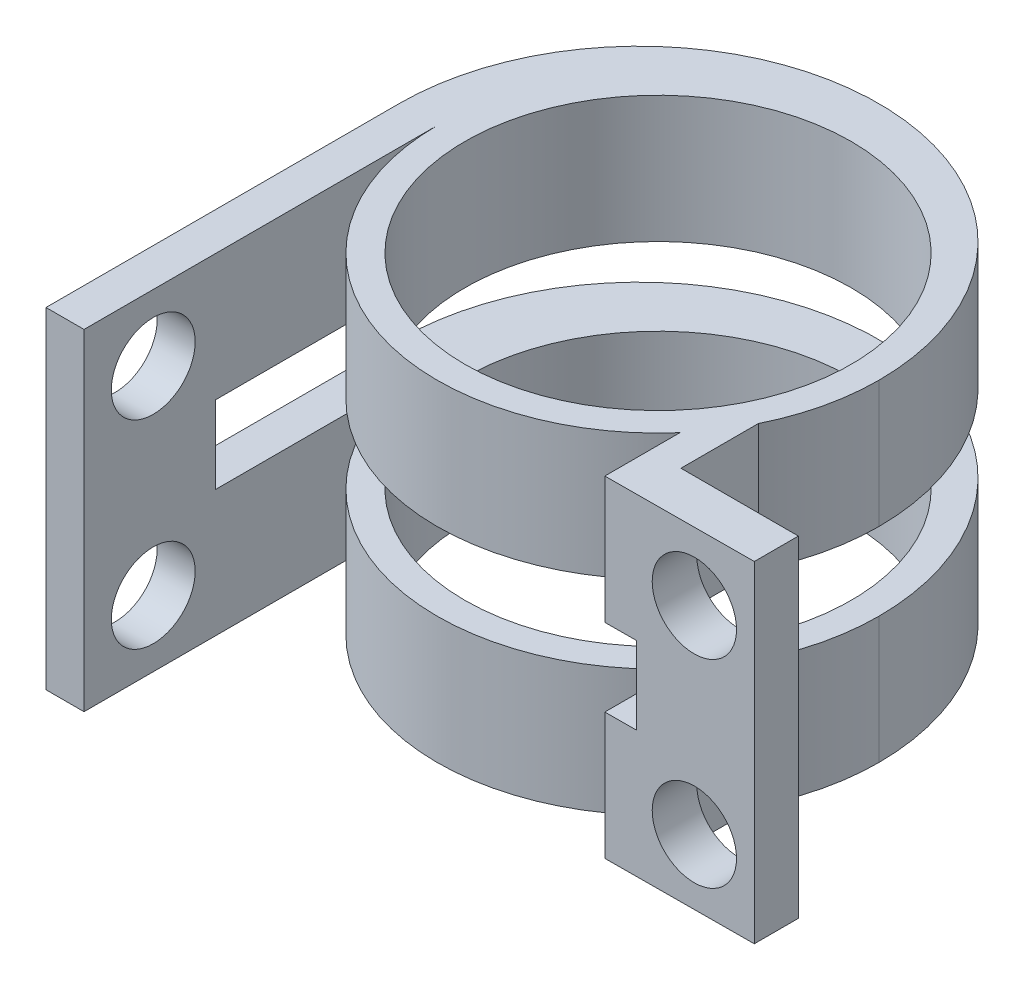
ISO-10303-21;
HEADER;
FILE_DESCRIPTION(('STEP AP214'),'2;1');
FILE_NAME('part.step','',(''),(''),'','','');
FILE_SCHEMA(('AUTOMOTIVE_DESIGN { 1 0 10303 214 1 1 1 1 }'));
ENDSEC;
DATA;
#1=APPLICATION_CONTEXT('core data for automotive mechanical design processes');
#2=APPLICATION_PROTOCOL_DEFINITION('international standard','automotive_design',2000,#1);
#3=PRODUCT_CONTEXT('',#1,'mechanical');
#4=PRODUCT('Part','Part','',(#3));
#5=PRODUCT_RELATED_PRODUCT_CATEGORY('part','',(#4));
#6=PRODUCT_DEFINITION_FORMATION('','',#4);
#7=PRODUCT_DEFINITION_CONTEXT('part definition',#1,'design');
#8=PRODUCT_DEFINITION('design','',#6,#7);
#9=PRODUCT_DEFINITION_SHAPE('','',#8);
#10=(LENGTH_UNIT() NAMED_UNIT(*) SI_UNIT(.MILLI.,.METRE.));
#11=(NAMED_UNIT(*) PLANE_ANGLE_UNIT() SI_UNIT($,.RADIAN.));
#12=(NAMED_UNIT(*) SI_UNIT($,.STERADIAN.) SOLID_ANGLE_UNIT());
#13=UNCERTAINTY_MEASURE_WITH_UNIT(LENGTH_MEASURE(1.E-05),#10,'distance_accuracy_value','');
#14=(GEOMETRIC_REPRESENTATION_CONTEXT(3) GLOBAL_UNCERTAINTY_ASSIGNED_CONTEXT((#13)) GLOBAL_UNIT_ASSIGNED_CONTEXT((#10,
#11,#12)) REPRESENTATION_CONTEXT('',''));
#15=CARTESIAN_POINT('',(0.,0.,0.));
#16=DIRECTION('',(0.,0.,1.));
#17=DIRECTION('',(1.,0.,0.));
#18=AXIS2_PLACEMENT_3D('',#15,#16,#17);
#19=CARTESIAN_POINT('',(-0.861319558408685,-15.,0.));
#20=DIRECTION('',(0.,1.,0.));
#21=DIRECTION('',(0.,0.,1.));
#22=AXIS2_PLACEMENT_3D('',#19,#20,#21);
#23=CYLINDRICAL_SURFACE('',#22,10.8613195584087);
#24=DIRECTION('',(0.,1.,0.));
#25=VECTOR('',#24,1.);
#26=CARTESIAN_POINT('',(10.,-15.,0.));
#27=LINE('',#26,#25);
#28=CARTESIAN_POINT('',(10.,-5.74132544668121,0.));
#29=VERTEX_POINT('',#28);
#30=CARTESIAN_POINT('',(10.,0.,0.));
#31=VERTEX_POINT('',#30);
#32=EDGE_CURVE('E236',#29,#31,#27,.T.);
#33=ORIENTED_EDGE('',*,*,#32,.F.);
#34=CARTESIAN_POINT('',(-0.861319558408685,-5.74132544668121,0.));
#35=DIRECTION('',(0.,-1.,0.));
#36=DIRECTION('',(0.,0.,-1.));
#37=AXIS2_PLACEMENT_3D('',#34,#35,#36);
#38=CIRCLE('',#37,10.8613195584087);
#39=CARTESIAN_POINT('',(-11.7226391168174,-5.74132544668121,0.));
#40=VERTEX_POINT('',#39);
#41=EDGE_CURVE('E254',#40,#29,#38,.T.);
#42=ORIENTED_EDGE('',*,*,#41,.F.);
#43=DIRECTION('',(0.,1.,0.));
#44=VECTOR('',#43,1.);
#45=CARTESIAN_POINT('',(-11.7226391168174,-15.,0.));
#46=LINE('',#45,#44);
#47=CARTESIAN_POINT('',(-11.7226391168174,0.,0.));
#48=VERTEX_POINT('',#47);
#49=EDGE_CURVE('E232',#40,#48,#46,.T.);
#50=ORIENTED_EDGE('',*,*,#49,.T.);
#51=CARTESIAN_POINT('',(-0.861319558408685,0.,0.));
#52=DIRECTION('',(0.,1.,0.));
#53=DIRECTION('',(0.,0.,1.));
#54=AXIS2_PLACEMENT_3D('',#51,#52,#53);
#55=CIRCLE('',#54,10.8613195584087);
#56=EDGE_CURVE('E187',#48,#31,#55,.F.);
#57=ORIENTED_EDGE('',*,*,#56,.T.);
#58=EDGE_LOOP('',(#33,#42,#50,#57));
#59=FACE_BOUND('',#58,.T.);
#60=ADVANCED_FACE('F37',(#59),#23,.T.);
#61=CARTESIAN_POINT('',(0.,-15.,0.));
#62=DIRECTION('',(0.,1.,0.));
#63=DIRECTION('',(0.,0.,1.));
#64=AXIS2_PLACEMENT_3D('',#61,#62,#63);
#65=CYLINDRICAL_SURFACE('',#64,10.);
#66=CARTESIAN_POINT('',(0.,-5.74132544668121,0.));
#67=DIRECTION('',(0.,1.,0.));
#68=DIRECTION('',(0.,0.,1.));
#69=AXIS2_PLACEMENT_3D('',#66,#67,#68);
#70=CIRCLE('',#69,10.);
#71=CARTESIAN_POINT('',(8.96768134899891,-5.74132544668121,4.42500748279788));
#72=VERTEX_POINT('',#71);
#73=EDGE_CURVE('E357',#29,#72,#70,.F.);
#74=ORIENTED_EDGE('',*,*,#73,.F.);
#75=ORIENTED_EDGE('',*,*,#32,.T.);
#76=CARTESIAN_POINT('',(0.,0.,0.));
#77=DIRECTION('',(0.,1.,0.));
#78=DIRECTION('',(0.,0.,1.));
#79=AXIS2_PLACEMENT_3D('',#76,#77,#78);
#80=CIRCLE('',#79,10.);
#81=CARTESIAN_POINT('',(8.96768134899891,0.,4.42500748279788));
#82=VERTEX_POINT('',#81);
#83=EDGE_CURVE('E183',#82,#31,#80,.T.);
#84=ORIENTED_EDGE('',*,*,#83,.F.);
#85=DIRECTION('',(0.,1.,0.));
#86=VECTOR('',#85,1.);
#87=CARTESIAN_POINT('',(8.96768134899891,-15.,4.42500748279788));
#88=LINE('',#87,#86);
#89=EDGE_CURVE('E179',#72,#82,#88,.T.);
#90=ORIENTED_EDGE('',*,*,#89,.F.);
#91=EDGE_LOOP('',(#74,#75,#84,#90));
#92=FACE_BOUND('',#91,.T.);
#93=ADVANCED_FACE('F444',(#92),#65,.T.);
#94=CARTESIAN_POINT('',(8.96768134899891,-15.,0.));
#95=DIRECTION('',(1.,0.,0.));
#96=DIRECTION('',(0.,0.,-1.));
#97=AXIS2_PLACEMENT_3D('',#94,#95,#96);
#98=PLANE('',#97);
#99=DIRECTION('',(0.,1.,0.));
#100=VECTOR('',#99,1.);
#101=CARTESIAN_POINT('',(8.96768134899891,-15.,7.9310168028268));
#102=LINE('',#101,#100);
#103=CARTESIAN_POINT('',(8.96768134899891,-5.74132544668121,7.9310168028268));
#104=VERTEX_POINT('',#103);
#105=CARTESIAN_POINT('',(8.96768134899891,0.,7.9310168028268));
#106=VERTEX_POINT('',#105);
#107=EDGE_CURVE('E104',#104,#106,#102,.T.);
#108=ORIENTED_EDGE('',*,*,#107,.F.);
#109=DIRECTION('',(0.,0.,-1.));
#110=VECTOR('',#109,1.);
#111=CARTESIAN_POINT('',(8.96768134899891,-5.74132544668121,0.));
#112=LINE('',#111,#110);
#113=EDGE_CURVE('E352',#104,#72,#112,.T.);
#114=ORIENTED_EDGE('',*,*,#113,.T.);
#115=ORIENTED_EDGE('',*,*,#89,.T.);
#116=DIRECTION('',(0.,0.,-1.));
#117=VECTOR('',#116,1.);
#118=CARTESIAN_POINT('',(8.96768134899891,0.,0.));
#119=LINE('',#118,#117);
#120=EDGE_CURVE('E180',#106,#82,#119,.T.);
#121=ORIENTED_EDGE('',*,*,#120,.F.);
#122=EDGE_LOOP('',(#108,#114,#115,#121));
#123=FACE_BOUND('',#122,.T.);
#124=ADVANCED_FACE('F448',(#123),#98,.T.);
#125=CARTESIAN_POINT('',(7.55,-15.,0.));
#126=DIRECTION('',(-1.,0.,0.));
#127=DIRECTION('',(0.,0.,1.));
#128=AXIS2_PLACEMENT_3D('',#125,#126,#127);
#129=PLANE('',#128);
#130=DIRECTION('',(0.,1.,0.));
#131=VECTOR('',#130,1.);
#132=CARTESIAN_POINT('',(7.55,-15.,6.55724789831832));
#133=LINE('',#132,#131);
#134=CARTESIAN_POINT('',(7.55,-5.74132544668121,6.55724789831832));
#135=VERTEX_POINT('',#134);
#136=CARTESIAN_POINT('',(7.55,0.,6.55724789831832));
#137=VERTEX_POINT('',#136);
#138=EDGE_CURVE('E218',#135,#137,#133,.T.);
#139=ORIENTED_EDGE('',*,*,#138,.F.);
#140=DIRECTION('',(0.,0.,1.));
#141=VECTOR('',#140,1.);
#142=CARTESIAN_POINT('',(7.55,-5.74132544668121,0.));
#143=LINE('',#142,#141);
#144=CARTESIAN_POINT('',(7.55,-5.74132544668121,9.96162024698262));
#145=VERTEX_POINT('',#144);
#146=EDGE_CURVE('E266',#135,#145,#143,.T.);
#147=ORIENTED_EDGE('',*,*,#146,.T.);
#148=DIRECTION('',(0.,1.,0.));
#149=VECTOR('',#148,1.);
#150=CARTESIAN_POINT('',(7.55,-15.,9.96162024698262));
#151=LINE('',#150,#149);
#152=CARTESIAN_POINT('',(7.55,0.,9.96162024698262));
#153=VERTEX_POINT('',#152);
#154=EDGE_CURVE('E214',#145,#153,#151,.T.);
#155=ORIENTED_EDGE('',*,*,#154,.T.);
#156=DIRECTION('',(0.,0.,1.));
#157=VECTOR('',#156,1.);
#158=CARTESIAN_POINT('',(7.55,0.,0.));
#159=LINE('',#158,#157);
#160=EDGE_CURVE('E198',#137,#153,#159,.T.);
#161=ORIENTED_EDGE('',*,*,#160,.F.);
#162=EDGE_LOOP('',(#139,#147,#155,#161));
#163=FACE_BOUND('',#162,.T.);
#164=ADVANCED_FACE('F382',(#163),#129,.T.);
#165=DIRECTION('',(0.,1.,0.));
#166=VECTOR('',#165,1.);
#167=CARTESIAN_POINT('',(-10.,-15.,0.));
#168=LINE('',#167,#166);
#169=CARTESIAN_POINT('',(-10.,-5.74132544668121,0.));
#170=VERTEX_POINT('',#169);
#171=CARTESIAN_POINT('',(-10.,0.,0.));
#172=VERTEX_POINT('',#171);
#173=EDGE_CURVE('E222',#170,#172,#168,.T.);
#174=ORIENTED_EDGE('',*,*,#173,.F.);
#175=CARTESIAN_POINT('',(0.,-5.74132544668121,0.));
#176=DIRECTION('',(0.,-1.,0.));
#177=DIRECTION('',(0.,0.,-1.));
#178=AXIS2_PLACEMENT_3D('',#175,#176,#177);
#179=CIRCLE('',#178,10.);
#180=EDGE_CURVE('E52',#170,#135,#179,.F.);
#181=ORIENTED_EDGE('',*,*,#180,.T.);
#182=ORIENTED_EDGE('',*,*,#138,.T.);
#183=EDGE_CURVE('E188',#172,#137,#80,.T.);
#184=ORIENTED_EDGE('',*,*,#183,.F.);
#185=EDGE_LOOP('',(#174,#181,#182,#184));
#186=FACE_BOUND('',#185,.T.);
#187=ADVANCED_FACE('F375',(#186),#65,.T.);
#188=CARTESIAN_POINT('',(0.,-15.,0.));
#189=DIRECTION('',(0.,1.,0.));
#190=DIRECTION('',(0.,0.,1.));
#191=AXIS2_PLACEMENT_3D('',#188,#189,#190);
#192=CYLINDRICAL_SURFACE('',#191,8.75);
#193=CARTESIAN_POINT('',(0.,0.,0.));
#194=DIRECTION('',(0.,1.,0.));
#195=DIRECTION('',(0.,0.,1.));
#196=AXIS2_PLACEMENT_3D('',#193,#194,#195);
#197=CIRCLE('',#196,8.75);
#198=CARTESIAN_POINT('',(0.,0.,8.75));
#199=VERTEX_POINT('',#198);
#200=EDGE_CURVE('E207',#199,#199,#197,.T.);
#201=ORIENTED_EDGE('',*,*,#200,.T.);
#202=EDGE_LOOP('',(#201));
#203=FACE_BOUND('',#202,.T.);
#204=CARTESIAN_POINT('',(0.,-5.74132544668121,0.));
#205=DIRECTION('',(0.,-1.,0.));
#206=DIRECTION('',(0.,0.,-1.));
#207=AXIS2_PLACEMENT_3D('',#204,#205,#206);
#208=CIRCLE('',#207,8.75);
#209=CARTESIAN_POINT('',(0.,-5.74132544668121,-8.75));
#210=VERTEX_POINT('',#209);
#211=EDGE_CURVE('E252',#210,#210,#208,.F.);
#212=ORIENTED_EDGE('',*,*,#211,.F.);
#213=EDGE_LOOP('',(#212));
#214=FACE_BOUND('',#213,.T.);
#215=ADVANCED_FACE('F458',(#203,#214),#192,.F.);
#216=DIRECTION('',(0.,0.,-1.));
#217=VECTOR('',#216,1.);
#218=CARTESIAN_POINT('',(8.96768134899891,-9.25867455331879,0.));
#219=LINE('',#218,#217);
#220=CARTESIAN_POINT('',(8.96768134899891,-9.25867455331879,7.9310168028268));
#221=VERTEX_POINT('',#220);
#222=CARTESIAN_POINT('',(8.96768134899891,-9.25867455331879,4.42500748279788));
#223=VERTEX_POINT('',#222);
#224=EDGE_CURVE('E353',#221,#223,#219,.T.);
#225=ORIENTED_EDGE('',*,*,#224,.F.);
#226=CARTESIAN_POINT('',(8.96768134899891,-15.,7.9310168028268));
#227=VERTEX_POINT('',#226);
#228=EDGE_CURVE('E45',#227,#221,#102,.T.);
#229=ORIENTED_EDGE('',*,*,#228,.F.);
#230=DIRECTION('',(0.,0.,-1.));
#231=VECTOR('',#230,1.);
#232=CARTESIAN_POINT('',(8.96768134899891,-15.,0.));
#233=LINE('',#232,#231);
#234=CARTESIAN_POINT('',(8.96768134899891,-15.,4.42500748279788));
#235=VERTEX_POINT('',#234);
#236=EDGE_CURVE('E210',#227,#235,#233,.T.);
#237=ORIENTED_EDGE('',*,*,#236,.T.);
#238=EDGE_CURVE('E113',#235,#223,#88,.T.);
#239=ORIENTED_EDGE('',*,*,#238,.T.);
#240=EDGE_LOOP('',(#225,#229,#237,#239));
#241=FACE_BOUND('',#240,.T.);
#242=ADVANCED_FACE('F39',(#241),#98,.T.);
#243=CARTESIAN_POINT('',(0.,-15.,7.9310168028268));
#244=DIRECTION('',(0.,0.,-1.));
#245=DIRECTION('',(-1.,0.,0.));
#246=AXIS2_PLACEMENT_3D('',#243,#244,#245);
#247=PLANE('',#246);
#248=CARTESIAN_POINT('',(11.5866385581315,-3.07185737953911,7.9310168028268));
#249=DIRECTION('',(0.,0.,-1.));
#250=DIRECTION('',(-1.,0.,0.));
#251=AXIS2_PLACEMENT_3D('',#248,#249,#250);
#252=CIRCLE('',#251,1.9);
#253=CARTESIAN_POINT('',(9.68663855813151,-3.07185737953911,7.9310168028268));
#254=VERTEX_POINT('',#253);
#255=EDGE_CURVE('E249',#254,#254,#252,.T.);
#256=ORIENTED_EDGE('',*,*,#255,.F.);
#257=EDGE_LOOP('',(#256));
#258=FACE_BOUND('',#257,.T.);
#259=CARTESIAN_POINT('',(11.5866385581315,-12.0514473820761,7.9310168028268));
#260=DIRECTION('',(0.,0.,-1.));
#261=DIRECTION('',(-1.,0.,0.));
#262=AXIS2_PLACEMENT_3D('',#259,#260,#261);
#263=CIRCLE('',#262,1.9);
#264=CARTESIAN_POINT('',(9.68663855813151,-12.0514473820761,7.9310168028268));
#265=VERTEX_POINT('',#264);
#266=EDGE_CURVE('E299',#265,#265,#263,.T.);
#267=ORIENTED_EDGE('',*,*,#266,.F.);
#268=EDGE_LOOP('',(#267));
#269=FACE_BOUND('',#268,.T.);
#270=DIRECTION('',(-1.,0.,0.));
#271=VECTOR('',#270,1.);
#272=CARTESIAN_POINT('',(0.,0.,7.9310168028268));
#273=LINE('',#272,#271);
#274=CARTESIAN_POINT('',(14.2891492785231,0.,7.9310168028268));
#275=VERTEX_POINT('',#274);
#276=EDGE_CURVE('E204',#275,#106,#273,.T.);
#277=ORIENTED_EDGE('',*,*,#276,.F.);
#278=DIRECTION('',(0.,1.,0.));
#279=VECTOR('',#278,1.);
#280=CARTESIAN_POINT('',(14.2891492785231,-15.,7.9310168028268));
#281=LINE('',#280,#279);
#282=CARTESIAN_POINT('',(14.2891492785231,-15.,7.9310168028268));
#283=VERTEX_POINT('',#282);
#284=EDGE_CURVE('E152',#283,#275,#281,.T.);
#285=ORIENTED_EDGE('',*,*,#284,.F.);
#286=DIRECTION('',(-1.,0.,0.));
#287=VECTOR('',#286,1.);
#288=CARTESIAN_POINT('',(0.,-15.,7.9310168028268));
#289=LINE('',#288,#287);
#290=EDGE_CURVE('E163',#283,#227,#289,.T.);
#291=ORIENTED_EDGE('',*,*,#290,.T.);
#292=ORIENTED_EDGE('',*,*,#228,.T.);
#293=DIRECTION('',(0.,-1.,0.));
#294=VECTOR('',#293,1.);
#295=CARTESIAN_POINT('',(8.96768134899891,-15.,7.9310168028268));
#296=LINE('',#295,#294);
#297=EDGE_CURVE('E293',#104,#221,#296,.T.);
#298=ORIENTED_EDGE('',*,*,#297,.F.);
#299=ORIENTED_EDGE('',*,*,#107,.T.);
#300=EDGE_LOOP('',(#277,#285,#291,#292,#298,#299));
#301=FACE_BOUND('',#300,.T.);
#302=ADVANCED_FACE('F449',(#258,#269,#301),#247,.T.);
#303=CARTESIAN_POINT('',(14.2891492785231,-15.,0.));
#304=DIRECTION('',(1.,0.,0.));
#305=DIRECTION('',(0.,0.,-1.));
#306=AXIS2_PLACEMENT_3D('',#303,#304,#305);
#307=PLANE('',#306);
#308=DIRECTION('',(0.,0.,-1.));
#309=VECTOR('',#308,1.);
#310=CARTESIAN_POINT('',(14.2891492785231,0.,0.));
#311=LINE('',#310,#309);
#312=CARTESIAN_POINT('',(14.2891492785231,0.,9.92724627007834));
#313=VERTEX_POINT('',#312);
#314=EDGE_CURVE('E147',#313,#275,#311,.T.);
#315=ORIENTED_EDGE('',*,*,#314,.F.);
#316=DIRECTION('',(0.,1.,0.));
#317=VECTOR('',#316,1.);
#318=CARTESIAN_POINT('',(14.2891492785231,-15.,9.92724627007834));
#319=LINE('',#318,#317);
#320=CARTESIAN_POINT('',(14.2891492785231,-15.,9.92724627007834));
#321=VERTEX_POINT('',#320);
#322=EDGE_CURVE('E141',#321,#313,#319,.T.);
#323=ORIENTED_EDGE('',*,*,#322,.F.);
#324=DIRECTION('',(0.,0.,-1.));
#325=VECTOR('',#324,1.);
#326=CARTESIAN_POINT('',(14.2891492785231,-15.,0.));
#327=LINE('',#326,#325);
#328=EDGE_CURVE('E144',#321,#283,#327,.T.);
#329=ORIENTED_EDGE('',*,*,#328,.T.);
#330=ORIENTED_EDGE('',*,*,#284,.T.);
#331=EDGE_LOOP('',(#315,#323,#329,#330));
#332=FACE_BOUND('',#331,.T.);
#333=ADVANCED_FACE('F143',(#332),#307,.T.);
#334=CARTESIAN_POINT('',(0.0510057402597,-15.,9.99986991987697));
#335=DIRECTION('',(0.00510057402597001,0.,0.999986991987698));
#336=DIRECTION('',(0.999986991987699,0.,-0.00510057402597001));
#337=AXIS2_PLACEMENT_3D('',#334,#335,#336);
#338=PLANE('',#337);
#339=DIRECTION('',(0.999986991987699,0.,-0.00510057402597001));
#340=VECTOR('',#339,1.);
#341=CARTESIAN_POINT('',(0.0510057402597,-9.25867455331879,9.99986991987697));
#342=LINE('',#341,#340);
#343=CARTESIAN_POINT('',(7.55,-9.25867455331879,9.96162024698262));
#344=VERTEX_POINT('',#343);
#345=CARTESIAN_POINT('',(8.96768134899891,-9.25867455331879,9.9543891642548));
#346=VERTEX_POINT('',#345);
#347=EDGE_CURVE('E287',#344,#346,#342,.T.);
#348=ORIENTED_EDGE('',*,*,#347,.F.);
#349=CARTESIAN_POINT('',(7.55,-15.,9.96162024698262));
#350=VERTEX_POINT('',#349);
#351=EDGE_CURVE('E153',#350,#344,#151,.T.);
#352=ORIENTED_EDGE('',*,*,#351,.F.);
#353=DIRECTION('',(0.999986991987699,0.,-0.00510057402597001));
#354=VECTOR('',#353,1.);
#355=CARTESIAN_POINT('',(0.0510057402597,-15.,9.99986991987697));
#356=LINE('',#355,#354);
#357=EDGE_CURVE('E160',#350,#321,#356,.T.);
#358=ORIENTED_EDGE('',*,*,#357,.T.);
#359=ORIENTED_EDGE('',*,*,#322,.T.);
#360=DIRECTION('',(0.999986991987699,0.,-0.00510057402597001));
#361=VECTOR('',#360,1.);
#362=CARTESIAN_POINT('',(0.0510057402597,0.,9.99986991987697));
#363=LINE('',#362,#361);
#364=EDGE_CURVE('E201',#153,#313,#363,.T.);
#365=ORIENTED_EDGE('',*,*,#364,.F.);
#366=ORIENTED_EDGE('',*,*,#154,.F.);
#367=DIRECTION('',(0.999986991987699,0.,-0.00510057402597001));
#368=VECTOR('',#367,1.);
#369=CARTESIAN_POINT('',(0.0510057402597,-5.74132544668121,9.99986991987697));
#370=LINE('',#369,#368);
#371=CARTESIAN_POINT('',(8.96768134899891,-5.74132544668121,9.9543891642548));
#372=VERTEX_POINT('',#371);
#373=EDGE_CURVE('E259',#145,#372,#370,.T.);
#374=ORIENTED_EDGE('',*,*,#373,.T.);
#375=DIRECTION('',(0.,1.,0.));
#376=VECTOR('',#375,1.);
#377=CARTESIAN_POINT('',(8.96768134899891,-15.,9.9543891642548));
#378=LINE('',#377,#376);
#379=EDGE_CURVE('E290',#346,#372,#378,.T.);
#380=ORIENTED_EDGE('',*,*,#379,.F.);
#381=EDGE_LOOP('',(#348,#352,#358,#359,#365,#366,#374,#380));
#382=FACE_BOUND('',#381,.T.);
#383=CARTESIAN_POINT('',(11.5866385581315,-3.07185737953911,9.94103080537308));
#384=DIRECTION('',(0.00510057402597001,0.,0.999986991987698));
#385=DIRECTION('',(0.999986991987699,0.,-0.00510057402597001));
#386=AXIS2_PLACEMENT_3D('',#383,#384,#385);
#387=ELLIPSE('',#386,1.90002471554487,1.9);
#388=CARTESIAN_POINT('',(13.4866385581315,-3.07185737953911,9.93133958866027));
#389=VERTEX_POINT('',#388);
#390=EDGE_CURVE('E242',#389,#389,#387,.T.);
#391=ORIENTED_EDGE('',*,*,#390,.F.);
#392=EDGE_LOOP('',(#391));
#393=FACE_BOUND('',#392,.T.);
#394=CARTESIAN_POINT('',(11.5866385581315,-12.0514473820761,9.94103080537308));
#395=DIRECTION('',(0.00510057402597001,0.,0.999986991987698));
#396=DIRECTION('',(0.999986991987699,0.,-0.00510057402597001));
#397=AXIS2_PLACEMENT_3D('',#394,#395,#396);
#398=ELLIPSE('',#397,1.90002471554487,1.9);
#399=CARTESIAN_POINT('',(13.4866385581315,-12.0514473820761,9.93133958866027));
#400=VERTEX_POINT('',#399);
#401=EDGE_CURVE('E246',#400,#400,#398,.T.);
#402=ORIENTED_EDGE('',*,*,#401,.F.);
#403=EDGE_LOOP('',(#402));
#404=FACE_BOUND('',#403,.T.);
#405=ADVANCED_FACE('F166',(#382,#393,#404),#338,.T.);
#406=DIRECTION('',(0.,0.,1.));
#407=VECTOR('',#406,1.);
#408=CARTESIAN_POINT('',(7.55,-9.25867455331879,0.));
#409=LINE('',#408,#407);
#410=CARTESIAN_POINT('',(7.55,-9.25867455331879,6.55724789831832));
#411=VERTEX_POINT('',#410);
#412=EDGE_CURVE('E284',#411,#344,#409,.T.);
#413=ORIENTED_EDGE('',*,*,#412,.F.);
#414=CARTESIAN_POINT('',(7.55,-15.,6.55724789831832));
#415=VERTEX_POINT('',#414);
#416=EDGE_CURVE('E215',#415,#411,#133,.T.);
#417=ORIENTED_EDGE('',*,*,#416,.F.);
#418=DIRECTION('',(0.,0.,1.));
#419=VECTOR('',#418,1.);
#420=CARTESIAN_POINT('',(7.55,-15.,0.));
#421=LINE('',#420,#419);
#422=EDGE_CURVE('E169',#415,#350,#421,.T.);
#423=ORIENTED_EDGE('',*,*,#422,.T.);
#424=ORIENTED_EDGE('',*,*,#351,.T.);
#425=EDGE_LOOP('',(#413,#417,#423,#424));
#426=FACE_BOUND('',#425,.T.);
#427=ADVANCED_FACE('F327',(#426),#129,.T.);
#428=CARTESIAN_POINT('',(0.,-9.25867455331879,0.));
#429=DIRECTION('',(0.,-1.,0.));
#430=DIRECTION('',(0.,0.,-1.));
#431=AXIS2_PLACEMENT_3D('',#428,#429,#430);
#432=CIRCLE('',#431,10.);
#433=CARTESIAN_POINT('',(-10.,-9.25867455331879,0.));
#434=VERTEX_POINT('',#433);
#435=EDGE_CURVE('E281',#434,#411,#432,.F.);
#436=ORIENTED_EDGE('',*,*,#435,.F.);
#437=CARTESIAN_POINT('',(-10.,-15.,0.));
#438=VERTEX_POINT('',#437);
#439=EDGE_CURVE('E219',#438,#434,#168,.T.);
#440=ORIENTED_EDGE('',*,*,#439,.F.);
#441=CARTESIAN_POINT('',(0.,-15.,0.));
#442=DIRECTION('',(0.,1.,0.));
#443=DIRECTION('',(0.,0.,1.));
#444=AXIS2_PLACEMENT_3D('',#441,#442,#443);
#445=CIRCLE('',#444,10.);
#446=EDGE_CURVE('E171',#438,#415,#445,.T.);
#447=ORIENTED_EDGE('',*,*,#446,.T.);
#448=ORIENTED_EDGE('',*,*,#416,.T.);
#449=EDGE_LOOP('',(#436,#440,#447,#448));
#450=FACE_BOUND('',#449,.T.);
#451=ADVANCED_FACE('F323',(#450),#65,.T.);
#452=CARTESIAN_POINT('',(-10.,-15.,0.));
#453=DIRECTION('',(-1.,0.,0.));
#454=DIRECTION('',(0.,0.,1.));
#455=AXIS2_PLACEMENT_3D('',#452,#453,#454);
#456=PLANE('',#455);
#457=CARTESIAN_POINT('',(-10.,-12.,12.8704842913034));
#458=DIRECTION('',(-1.,0.,0.));
#459=DIRECTION('',(0.,0.,1.));
#460=AXIS2_PLACEMENT_3D('',#457,#458,#459);
#461=CIRCLE('',#460,1.9);
#462=CARTESIAN_POINT('',(-10.,-12.,14.7704842913034));
#463=VERTEX_POINT('',#462);
#464=EDGE_CURVE('E184',#463,#463,#461,.F.);
#465=ORIENTED_EDGE('',*,*,#464,.F.);
#466=EDGE_LOOP('',(#465));
#467=FACE_BOUND('',#466,.T.);
#468=CARTESIAN_POINT('',(-10.,-3.,12.8704842913034));
#469=DIRECTION('',(-1.,0.,0.));
#470=DIRECTION('',(0.,0.,1.));
#471=AXIS2_PLACEMENT_3D('',#468,#469,#470);
#472=CIRCLE('',#471,1.9);
#473=CARTESIAN_POINT('',(-10.,-3.,14.7704842913034));
#474=VERTEX_POINT('',#473);
#475=EDGE_CURVE('E241',#474,#474,#472,.F.);
#476=ORIENTED_EDGE('',*,*,#475,.F.);
#477=EDGE_LOOP('',(#476));
#478=FACE_BOUND('',#477,.T.);
#479=ORIENTED_EDGE('',*,*,#439,.T.);
#480=DIRECTION('',(0.,0.,1.));
#481=VECTOR('',#480,1.);
#482=CARTESIAN_POINT('',(-10.,-9.25867455331879,0.));
#483=LINE('',#482,#481);
#484=CARTESIAN_POINT('',(-9.99999999999999,-9.25867455331879,10.048040221904));
#485=VERTEX_POINT('',#484);
#486=EDGE_CURVE('E278',#434,#485,#483,.T.);
#487=ORIENTED_EDGE('',*,*,#486,.T.);
#488=DIRECTION('',(0.,1.,0.));
#489=VECTOR('',#488,1.);
#490=CARTESIAN_POINT('',(-10.,-15.,10.048040221904));
#491=LINE('',#490,#489);
#492=CARTESIAN_POINT('',(-9.99999999999999,-5.74132544668121,10.048040221904));
#493=VERTEX_POINT('',#492);
#494=EDGE_CURVE('E296',#485,#493,#491,.T.);
#495=ORIENTED_EDGE('',*,*,#494,.T.);
#496=DIRECTION('',(0.,0.,1.));
#497=VECTOR('',#496,1.);
#498=CARTESIAN_POINT('',(-10.,-5.74132544668121,0.));
#499=LINE('',#498,#497);
#500=EDGE_CURVE('E371',#170,#493,#499,.T.);
#501=ORIENTED_EDGE('',*,*,#500,.F.);
#502=ORIENTED_EDGE('',*,*,#173,.T.);
#503=DIRECTION('',(0.,0.,1.));
#504=VECTOR('',#503,1.);
#505=CARTESIAN_POINT('',(-10.,0.,0.));
#506=LINE('',#505,#504);
#507=CARTESIAN_POINT('',(-10.,0.,16.0058640923073));
#508=VERTEX_POINT('',#507);
#509=EDGE_CURVE('E196',#172,#508,#506,.T.);
#510=ORIENTED_EDGE('',*,*,#509,.T.);
#511=DIRECTION('',(0.,1.,0.));
#512=VECTOR('',#511,1.);
#513=CARTESIAN_POINT('',(-10.,-15.,16.0058640923073));
#514=LINE('',#513,#512);
#515=CARTESIAN_POINT('',(-10.,-15.,16.0058640923073));
#516=VERTEX_POINT('',#515);
#517=EDGE_CURVE('E223',#516,#508,#514,.T.);
#518=ORIENTED_EDGE('',*,*,#517,.F.);
#519=DIRECTION('',(0.,0.,1.));
#520=VECTOR('',#519,1.);
#521=CARTESIAN_POINT('',(-10.,-15.,0.));
#522=LINE('',#521,#520);
#523=EDGE_CURVE('E316',#438,#516,#522,.T.);
#524=ORIENTED_EDGE('',*,*,#523,.F.);
#525=EDGE_LOOP('',(#479,#487,#495,#501,#502,#510,#518,#524));
#526=FACE_BOUND('',#525,.T.);
#527=ADVANCED_FACE('F391',(#467,#478,#526),#456,.F.);
#528=CARTESIAN_POINT('',(0.,-15.,16.0058640923073));
#529=DIRECTION('',(0.,0.,-1.));
#530=DIRECTION('',(-1.,0.,0.));
#531=AXIS2_PLACEMENT_3D('',#528,#529,#530);
#532=PLANE('',#531);
#533=DIRECTION('',(-1.,0.,0.));
#534=VECTOR('',#533,1.);
#535=CARTESIAN_POINT('',(0.,0.,16.0058640923073));
#536=LINE('',#535,#534);
#537=CARTESIAN_POINT('',(-11.7226391168174,0.,16.0058640923073));
#538=VERTEX_POINT('',#537);
#539=EDGE_CURVE('E194',#508,#538,#536,.T.);
#540=ORIENTED_EDGE('',*,*,#539,.T.);
#541=DIRECTION('',(0.,1.,0.));
#542=VECTOR('',#541,1.);
#543=CARTESIAN_POINT('',(-11.7226391168174,-15.,16.0058640923073));
#544=LINE('',#543,#542);
#545=CARTESIAN_POINT('',(-11.7226391168174,-15.,16.0058640923073));
#546=VERTEX_POINT('',#545);
#547=EDGE_CURVE('E226',#546,#538,#544,.T.);
#548=ORIENTED_EDGE('',*,*,#547,.F.);
#549=DIRECTION('',(-1.,0.,0.));
#550=VECTOR('',#549,1.);
#551=CARTESIAN_POINT('',(0.,-15.,16.0058640923073));
#552=LINE('',#551,#550);
#553=EDGE_CURVE('E315',#516,#546,#552,.T.);
#554=ORIENTED_EDGE('',*,*,#553,.F.);
#555=ORIENTED_EDGE('',*,*,#517,.T.);
#556=EDGE_LOOP('',(#540,#548,#554,#555));
#557=FACE_BOUND('',#556,.T.);
#558=ADVANCED_FACE('F394',(#557),#532,.F.);
#559=CARTESIAN_POINT('',(-11.7226391168174,-15.,0.));
#560=DIRECTION('',(1.,0.,0.));
#561=DIRECTION('',(0.,0.,-1.));
#562=AXIS2_PLACEMENT_3D('',#559,#560,#561);
#563=PLANE('',#562);
#564=CARTESIAN_POINT('',(-11.7226391168174,-12.,12.8704842913034));
#565=DIRECTION('',(1.,0.,0.));
#566=DIRECTION('',(0.,0.,-1.));
#567=AXIS2_PLACEMENT_3D('',#564,#565,#566);
#568=CIRCLE('',#567,1.9);
#569=CARTESIAN_POINT('',(-11.7226391168174,-12.,10.9704842913034));
#570=VERTEX_POINT('',#569);
#571=EDGE_CURVE('E243',#570,#570,#568,.F.);
#572=ORIENTED_EDGE('',*,*,#571,.F.);
#573=EDGE_LOOP('',(#572));
#574=FACE_BOUND('',#573,.T.);
#575=CARTESIAN_POINT('',(-11.7226391168174,-3.,12.8704842913034));
#576=DIRECTION('',(1.,0.,0.));
#577=DIRECTION('',(0.,0.,-1.));
#578=AXIS2_PLACEMENT_3D('',#575,#576,#577);
#579=CIRCLE('',#578,1.9);
#580=CARTESIAN_POINT('',(-11.7226391168174,-3.,10.9704842913034));
#581=VERTEX_POINT('',#580);
#582=EDGE_CURVE('E238',#581,#581,#579,.F.);
#583=ORIENTED_EDGE('',*,*,#582,.F.);
#584=EDGE_LOOP('',(#583));
#585=FACE_BOUND('',#584,.T.);
#586=DIRECTION('',(0.,-1.,0.));
#587=VECTOR('',#586,1.);
#588=CARTESIAN_POINT('',(-11.7226391168174,-15.,10.048040221904));
#589=LINE('',#588,#587);
#590=CARTESIAN_POINT('',(-11.7226391168174,-5.74132544668121,10.048040221904));
#591=VERTEX_POINT('',#590);
#592=CARTESIAN_POINT('',(-11.7226391168174,-9.25867455331879,10.048040221904));
#593=VERTEX_POINT('',#592);
#594=EDGE_CURVE('E11',#591,#593,#589,.T.);
#595=ORIENTED_EDGE('',*,*,#594,.T.);
#596=DIRECTION('',(0.,0.,-1.));
#597=VECTOR('',#596,1.);
#598=CARTESIAN_POINT('',(-11.7226391168174,-9.25867455331879,0.));
#599=LINE('',#598,#597);
#600=CARTESIAN_POINT('',(-11.7226391168174,-9.25867455331879,0.));
#601=VERTEX_POINT('',#600);
#602=EDGE_CURVE('E263',#593,#601,#599,.T.);
#603=ORIENTED_EDGE('',*,*,#602,.T.);
#604=CARTESIAN_POINT('',(-11.7226391168174,-15.,0.));
#605=VERTEX_POINT('',#604);
#606=EDGE_CURVE('E229',#605,#601,#46,.T.);
#607=ORIENTED_EDGE('',*,*,#606,.F.);
#608=DIRECTION('',(0.,0.,-1.));
#609=VECTOR('',#608,1.);
#610=CARTESIAN_POINT('',(-11.7226391168174,-15.,0.));
#611=LINE('',#610,#609);
#612=EDGE_CURVE('E313',#546,#605,#611,.T.);
#613=ORIENTED_EDGE('',*,*,#612,.F.);
#614=ORIENTED_EDGE('',*,*,#547,.T.);
#615=DIRECTION('',(0.,0.,-1.));
#616=VECTOR('',#615,1.);
#617=CARTESIAN_POINT('',(-11.7226391168174,0.,0.));
#618=LINE('',#617,#616);
#619=EDGE_CURVE('E191',#538,#48,#618,.T.);
#620=ORIENTED_EDGE('',*,*,#619,.T.);
#621=ORIENTED_EDGE('',*,*,#49,.F.);
#622=DIRECTION('',(0.,0.,-1.));
#623=VECTOR('',#622,1.);
#624=CARTESIAN_POINT('',(-11.7226391168174,-5.74132544668121,0.));
#625=LINE('',#624,#623);
#626=EDGE_CURVE('E368',#591,#40,#625,.T.);
#627=ORIENTED_EDGE('',*,*,#626,.F.);
#628=EDGE_LOOP('',(#595,#603,#607,#613,#614,#620,#621,#627));
#629=FACE_BOUND('',#628,.T.);
#630=ADVANCED_FACE('F401',(#574,#585,#629),#563,.F.);
#631=CARTESIAN_POINT('',(-0.861319558408685,-9.25867455331879,0.));
#632=DIRECTION('',(0.,-1.,0.));
#633=DIRECTION('',(0.,0.,-1.));
#634=AXIS2_PLACEMENT_3D('',#631,#632,#633);
#635=CIRCLE('',#634,10.8613195584087);
#636=CARTESIAN_POINT('',(10.,-9.25867455331879,0.));
#637=VERTEX_POINT('',#636);
#638=EDGE_CURVE('E258',#601,#637,#635,.T.);
#639=ORIENTED_EDGE('',*,*,#638,.T.);
#640=CARTESIAN_POINT('',(10.,-15.,0.));
#641=VERTEX_POINT('',#640);
#642=EDGE_CURVE('E233',#641,#637,#27,.T.);
#643=ORIENTED_EDGE('',*,*,#642,.F.);
#644=CARTESIAN_POINT('',(-0.861319558408685,-15.,0.));
#645=DIRECTION('',(0.,1.,0.));
#646=DIRECTION('',(0.,0.,1.));
#647=AXIS2_PLACEMENT_3D('',#644,#645,#646);
#648=CIRCLE('',#647,10.8613195584087);
#649=EDGE_CURVE('E311',#605,#641,#648,.F.);
#650=ORIENTED_EDGE('',*,*,#649,.F.);
#651=ORIENTED_EDGE('',*,*,#606,.T.);
#652=EDGE_LOOP('',(#639,#643,#650,#651));
#653=FACE_BOUND('',#652,.T.);
#654=ADVANCED_FACE('F406',(#653),#23,.T.);
#655=CARTESIAN_POINT('',(0.,-9.25867455331879,0.));
#656=DIRECTION('',(0.,-1.,0.));
#657=DIRECTION('',(0.,0.,-1.));
#658=AXIS2_PLACEMENT_3D('',#655,#656,#657);
#659=CIRCLE('',#658,10.);
#660=EDGE_CURVE('E446',#223,#637,#659,.F.);
#661=ORIENTED_EDGE('',*,*,#660,.F.);
#662=ORIENTED_EDGE('',*,*,#238,.F.);
#663=EDGE_CURVE('E309',#235,#641,#445,.T.);
#664=ORIENTED_EDGE('',*,*,#663,.T.);
#665=ORIENTED_EDGE('',*,*,#642,.T.);
#666=EDGE_LOOP('',(#661,#662,#664,#665));
#667=FACE_BOUND('',#666,.T.);
#668=ADVANCED_FACE('F408',(#667),#65,.T.);
#669=CARTESIAN_POINT('',(0.,-9.25867455331879,0.));
#670=DIRECTION('',(0.,-1.,0.));
#671=DIRECTION('',(0.,0.,-1.));
#672=AXIS2_PLACEMENT_3D('',#669,#670,#671);
#673=CIRCLE('',#672,8.75);
#674=CARTESIAN_POINT('',(0.,-9.25867455331879,-8.75));
#675=VERTEX_POINT('',#674);
#676=EDGE_CURVE('E256',#675,#675,#673,.F.);
#677=ORIENTED_EDGE('',*,*,#676,.T.);
#678=EDGE_LOOP('',(#677));
#679=FACE_BOUND('',#678,.T.);
#680=CARTESIAN_POINT('',(0.,-15.,0.));
#681=DIRECTION('',(0.,1.,0.));
#682=DIRECTION('',(0.,0.,1.));
#683=AXIS2_PLACEMENT_3D('',#680,#681,#682);
#684=CIRCLE('',#683,8.75);
#685=CARTESIAN_POINT('',(0.,-15.,8.75));
#686=VERTEX_POINT('',#685);
#687=EDGE_CURVE('E176',#686,#686,#684,.T.);
#688=ORIENTED_EDGE('',*,*,#687,.F.);
#689=EDGE_LOOP('',(#688));
#690=FACE_BOUND('',#689,.T.);
#691=ADVANCED_FACE('F473',(#679,#690),#192,.F.);
#692=CARTESIAN_POINT('',(0.,-15.,0.));
#693=DIRECTION('',(0.,1.,0.));
#694=DIRECTION('',(0.,0.,1.));
#695=AXIS2_PLACEMENT_3D('',#692,#693,#694);
#696=PLANE('',#695);
#697=ORIENTED_EDGE('',*,*,#236,.F.);
#698=ORIENTED_EDGE('',*,*,#290,.F.);
#699=ORIENTED_EDGE('',*,*,#328,.F.);
#700=ORIENTED_EDGE('',*,*,#357,.F.);
#701=ORIENTED_EDGE('',*,*,#422,.F.);
#702=ORIENTED_EDGE('',*,*,#446,.F.);
#703=ORIENTED_EDGE('',*,*,#523,.T.);
#704=ORIENTED_EDGE('',*,*,#553,.T.);
#705=ORIENTED_EDGE('',*,*,#612,.T.);
#706=ORIENTED_EDGE('',*,*,#649,.T.);
#707=ORIENTED_EDGE('',*,*,#663,.F.);
#708=EDGE_LOOP('',(#697,#698,#699,#700,#701,#702,#703,#704,#705,#706,#707));
#709=FACE_BOUND('',#708,.T.);
#710=ORIENTED_EDGE('',*,*,#687,.T.);
#711=EDGE_LOOP('',(#710));
#712=FACE_BOUND('',#711,.T.);
#713=ADVANCED_FACE('F157',(#709,#712),#696,.F.);
#714=CARTESIAN_POINT('',(0.,0.,0.));
#715=DIRECTION('',(0.,1.,0.));
#716=DIRECTION('',(0.,0.,1.));
#717=AXIS2_PLACEMENT_3D('',#714,#715,#716);
#718=PLANE('',#717);
#719=ORIENTED_EDGE('',*,*,#120,.T.);
#720=ORIENTED_EDGE('',*,*,#83,.T.);
#721=ORIENTED_EDGE('',*,*,#56,.F.);
#722=ORIENTED_EDGE('',*,*,#619,.F.);
#723=ORIENTED_EDGE('',*,*,#539,.F.);
#724=ORIENTED_EDGE('',*,*,#509,.F.);
#725=ORIENTED_EDGE('',*,*,#183,.T.);
#726=ORIENTED_EDGE('',*,*,#160,.T.);
#727=ORIENTED_EDGE('',*,*,#364,.T.);
#728=ORIENTED_EDGE('',*,*,#314,.T.);
#729=ORIENTED_EDGE('',*,*,#276,.T.);
#730=EDGE_LOOP('',(#719,#720,#721,#722,#723,#724,#725,#726,#727,#728,#729));
#731=FACE_BOUND('',#730,.T.);
#732=ORIENTED_EDGE('',*,*,#200,.F.);
#733=EDGE_LOOP('',(#732));
#734=FACE_BOUND('',#733,.T.);
#735=ADVANCED_FACE('F386',(#731,#734),#718,.T.);
#736=CARTESIAN_POINT('',(-30.8238542447875,-3.,12.8704842913034));
#737=DIRECTION('',(1.,0.,0.));
#738=DIRECTION('',(0.,0.,-1.));
#739=AXIS2_PLACEMENT_3D('',#736,#737,#738);
#740=CYLINDRICAL_SURFACE('',#739,1.9);
#741=ORIENTED_EDGE('',*,*,#582,.T.);
#742=EDGE_LOOP('',(#741));
#743=FACE_BOUND('',#742,.T.);
#744=ORIENTED_EDGE('',*,*,#475,.T.);
#745=EDGE_LOOP('',(#744));
#746=FACE_BOUND('',#745,.T.);
#747=ADVANCED_FACE('F534',(#743,#746),#740,.F.);
#748=CARTESIAN_POINT('',(-30.8238542447875,-12.,12.8704842913034));
#749=DIRECTION('',(1.,0.,0.));
#750=DIRECTION('',(0.,0.,-1.));
#751=AXIS2_PLACEMENT_3D('',#748,#749,#750);
#752=CYLINDRICAL_SURFACE('',#751,1.9);
#753=ORIENTED_EDGE('',*,*,#571,.T.);
#754=EDGE_LOOP('',(#753));
#755=FACE_BOUND('',#754,.T.);
#756=ORIENTED_EDGE('',*,*,#464,.T.);
#757=EDGE_LOOP('',(#756));
#758=FACE_BOUND('',#757,.T.);
#759=ADVANCED_FACE('F544',(#755,#758),#752,.F.);
#760=CARTESIAN_POINT('',(11.5866385581315,-12.0514473820761,17.9310168028268));
#761=DIRECTION('',(0.,0.,-1.));
#762=DIRECTION('',(-1.,0.,0.));
#763=AXIS2_PLACEMENT_3D('',#760,#761,#762);
#764=CYLINDRICAL_SURFACE('',#763,1.9);
#765=ORIENTED_EDGE('',*,*,#401,.T.);
#766=EDGE_LOOP('',(#765));
#767=FACE_BOUND('',#766,.T.);
#768=ORIENTED_EDGE('',*,*,#266,.T.);
#769=EDGE_LOOP('',(#768));
#770=FACE_BOUND('',#769,.T.);
#771=ADVANCED_FACE('F554',(#767,#770),#764,.F.);
#772=CARTESIAN_POINT('',(11.5866385581315,-3.07185737953911,17.9310168028268));
#773=DIRECTION('',(0.,0.,-1.));
#774=DIRECTION('',(-1.,0.,0.));
#775=AXIS2_PLACEMENT_3D('',#772,#773,#774);
#776=CYLINDRICAL_SURFACE('',#775,1.9);
#777=ORIENTED_EDGE('',*,*,#390,.T.);
#778=EDGE_LOOP('',(#777));
#779=FACE_BOUND('',#778,.T.);
#780=ORIENTED_EDGE('',*,*,#255,.T.);
#781=EDGE_LOOP('',(#780));
#782=FACE_BOUND('',#781,.T.);
#783=ADVANCED_FACE('F564',(#779,#782),#776,.F.);
#784=CARTESIAN_POINT('',(-120.032318651001,0.,10.048040221904));
#785=DIRECTION('',(0.,0.,1.));
#786=DIRECTION('',(1.,0.,0.));
#787=AXIS2_PLACEMENT_3D('',#784,#785,#786);
#788=PLANE('',#787);
#789=DIRECTION('',(1.,0.,0.));
#790=VECTOR('',#789,1.);
#791=CARTESIAN_POINT('',(-120.032318651001,-9.25867455331879,10.048040221904));
#792=LINE('',#791,#790);
#793=EDGE_CURVE('E255',#593,#485,#792,.T.);
#794=ORIENTED_EDGE('',*,*,#793,.F.);
#795=ORIENTED_EDGE('',*,*,#594,.F.);
#796=DIRECTION('',(1.,0.,0.));
#797=VECTOR('',#796,1.);
#798=CARTESIAN_POINT('',(-120.032318651001,-5.74132544668121,10.048040221904));
#799=LINE('',#798,#797);
#800=EDGE_CURVE('E363',#591,#493,#799,.T.);
#801=ORIENTED_EDGE('',*,*,#800,.T.);
#802=ORIENTED_EDGE('',*,*,#494,.F.);
#803=EDGE_LOOP('',(#794,#795,#801,#802));
#804=FACE_BOUND('',#803,.T.);
#805=ADVANCED_FACE('F433',(#804),#788,.F.);
#806=CARTESIAN_POINT('',(8.96768134899891,0.,0.));
#807=DIRECTION('',(1.,0.,0.));
#808=DIRECTION('',(0.,0.,-1.));
#809=AXIS2_PLACEMENT_3D('',#806,#807,#808);
#810=PLANE('',#809);
#811=ORIENTED_EDGE('',*,*,#297,.T.);
#812=EDGE_CURVE('E345',#346,#221,#219,.T.);
#813=ORIENTED_EDGE('',*,*,#812,.F.);
#814=ORIENTED_EDGE('',*,*,#379,.T.);
#815=EDGE_CURVE('E344',#372,#104,#112,.T.);
#816=ORIENTED_EDGE('',*,*,#815,.T.);
#817=EDGE_LOOP('',(#811,#813,#814,#816));
#818=FACE_BOUND('',#817,.T.);
#819=ADVANCED_FACE('F342',(#818),#810,.F.);
#820=CARTESIAN_POINT('',(-120.032318651001,-9.25867455331879,0.));
#821=DIRECTION('',(0.,-1.,0.));
#822=DIRECTION('',(0.,0.,-1.));
#823=AXIS2_PLACEMENT_3D('',#820,#821,#822);
#824=PLANE('',#823);
#825=ORIENTED_EDGE('',*,*,#676,.F.);
#826=EDGE_LOOP('',(#825));
#827=FACE_BOUND('',#826,.T.);
#828=ORIENTED_EDGE('',*,*,#660,.T.);
#829=ORIENTED_EDGE('',*,*,#638,.F.);
#830=ORIENTED_EDGE('',*,*,#602,.F.);
#831=ORIENTED_EDGE('',*,*,#793,.T.);
#832=ORIENTED_EDGE('',*,*,#486,.F.);
#833=ORIENTED_EDGE('',*,*,#435,.T.);
#834=ORIENTED_EDGE('',*,*,#412,.T.);
#835=ORIENTED_EDGE('',*,*,#347,.T.);
#836=ORIENTED_EDGE('',*,*,#812,.T.);
#837=ORIENTED_EDGE('',*,*,#224,.T.);
#838=EDGE_LOOP('',(#828,#829,#830,#831,#832,#833,#834,#835,#836,#837));
#839=FACE_BOUND('',#838,.T.);
#840=ADVANCED_FACE('F331',(#827,#839),#824,.F.);
#841=CARTESIAN_POINT('',(-120.032318651001,-5.74132544668121,0.));
#842=DIRECTION('',(0.,-1.,0.));
#843=DIRECTION('',(0.,0.,-1.));
#844=AXIS2_PLACEMENT_3D('',#841,#842,#843);
#845=PLANE('',#844);
#846=ORIENTED_EDGE('',*,*,#211,.T.);
#847=EDGE_LOOP('',(#846));
#848=FACE_BOUND('',#847,.T.);
#849=ORIENTED_EDGE('',*,*,#73,.T.);
#850=ORIENTED_EDGE('',*,*,#113,.F.);
#851=ORIENTED_EDGE('',*,*,#815,.F.);
#852=ORIENTED_EDGE('',*,*,#373,.F.);
#853=ORIENTED_EDGE('',*,*,#146,.F.);
#854=ORIENTED_EDGE('',*,*,#180,.F.);
#855=ORIENTED_EDGE('',*,*,#500,.T.);
#856=ORIENTED_EDGE('',*,*,#800,.F.);
#857=ORIENTED_EDGE('',*,*,#626,.T.);
#858=ORIENTED_EDGE('',*,*,#41,.T.);
#859=EDGE_LOOP('',(#849,#850,#851,#852,#853,#854,#855,#856,#857,#858));
#860=FACE_BOUND('',#859,.T.);
#861=ADVANCED_FACE('F350',(#848,#860),#845,.T.);
#862=CLOSED_SHELL('',(#60,#93,#124,#164,#187,#215,#242,#302,#333,#405,#427,#451,#527,#558,#630,
#654,#668,#691,#713,#735,#747,#759,#771,#783,#805,#819,#840,#861));
#863=MANIFOLD_SOLID_BREP('B2',#862);
#864=ADVANCED_BREP_SHAPE_REPRESENTATION('',(#18,#863),#14);
#865=SHAPE_DEFINITION_REPRESENTATION(#9,#864);
ENDSEC;
END-ISO-10303-21;
